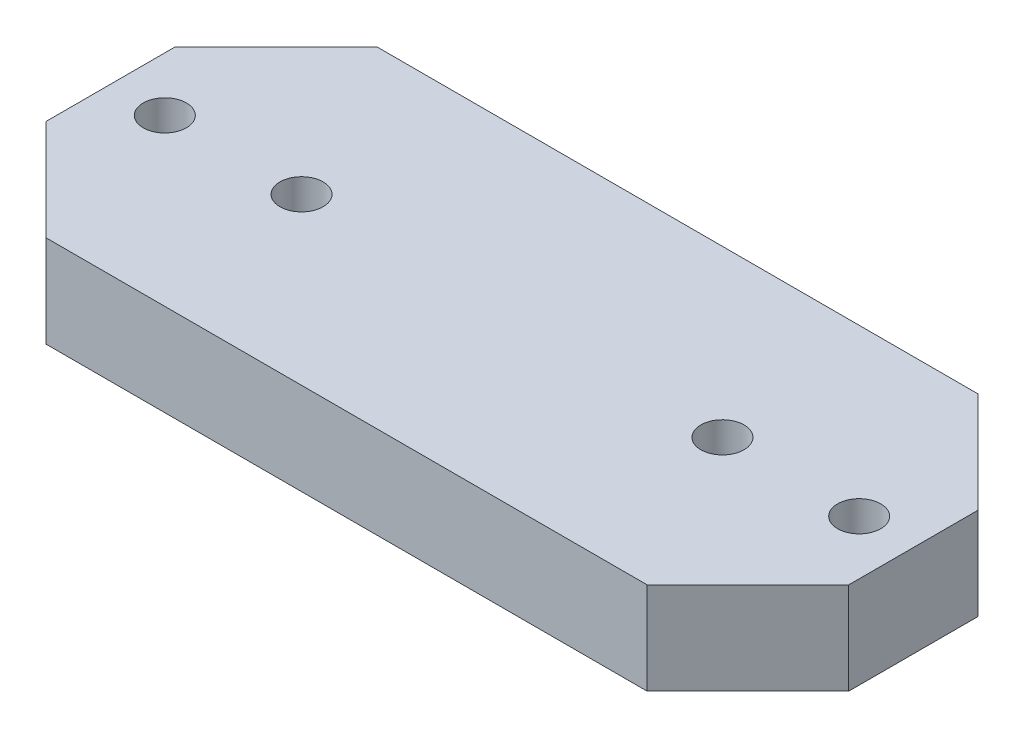
ISO-10303-21;
HEADER;
FILE_DESCRIPTION(('STEP AP214'),'2;1');
FILE_NAME('part.step','',(''),(''),'','','');
FILE_SCHEMA(('AUTOMOTIVE_DESIGN { 1 0 10303 214 1 1 1 1 }'));
ENDSEC;
DATA;
#1=APPLICATION_CONTEXT('core data for automotive mechanical design processes');
#2=APPLICATION_PROTOCOL_DEFINITION('international standard','automotive_design',2000,#1);
#3=PRODUCT_CONTEXT('',#1,'mechanical');
#4=PRODUCT('Part','Part','',(#3));
#5=PRODUCT_RELATED_PRODUCT_CATEGORY('part','',(#4));
#6=PRODUCT_DEFINITION_FORMATION('','',#4);
#7=PRODUCT_DEFINITION_CONTEXT('part definition',#1,'design');
#8=PRODUCT_DEFINITION('design','',#6,#7);
#9=PRODUCT_DEFINITION_SHAPE('','',#8);
#10=(LENGTH_UNIT() NAMED_UNIT(*) SI_UNIT(.MILLI.,.METRE.));
#11=(NAMED_UNIT(*) PLANE_ANGLE_UNIT() SI_UNIT($,.RADIAN.));
#12=(NAMED_UNIT(*) SI_UNIT($,.STERADIAN.) SOLID_ANGLE_UNIT());
#13=UNCERTAINTY_MEASURE_WITH_UNIT(LENGTH_MEASURE(1.E-05),#10,'distance_accuracy_value','');
#14=(GEOMETRIC_REPRESENTATION_CONTEXT(3) GLOBAL_UNCERTAINTY_ASSIGNED_CONTEXT((#13)) GLOBAL_UNIT_ASSIGNED_CONTEXT((#10,
#11,#12)) REPRESENTATION_CONTEXT('',''));
#15=CARTESIAN_POINT('',(0.,0.,0.));
#16=DIRECTION('',(0.,0.,1.));
#17=DIRECTION('',(1.,0.,0.));
#18=AXIS2_PLACEMENT_3D('',#15,#16,#17);
#19=CARTESIAN_POINT('',(61.1827241078742,6.4,-18.6584898350286));
#20=DIRECTION('',(0.,-1.,0.));
#21=DIRECTION('',(0.,0.,-1.));
#22=AXIS2_PLACEMENT_3D('',#19,#20,#21);
#23=PLANE('',#22);
#24=CARTESIAN_POINT('',(103.696101319983,6.4,-7.16509059439813));
#25=DIRECTION('',(0.,1.,0.));
#26=DIRECTION('',(0.,0.,-1.));
#27=AXIS2_PLACEMENT_3D('',#24,#25,#26);
#28=CIRCLE('',#27,1.50000000004747);
#29=CARTESIAN_POINT('',(103.696101319983,6.4,-8.6650905944456));
#30=VERTEX_POINT('',#29);
#31=EDGE_CURVE('E187',#30,#30,#28,.T.);
#32=ORIENTED_EDGE('',*,*,#31,.F.);
#33=EDGE_LOOP('',(#32));
#34=FACE_BOUND('',#33,.T.);
#35=CARTESIAN_POINT('',(74.4461013195849,6.4,-7.16509059439812));
#36=DIRECTION('',(0.,1.,0.));
#37=DIRECTION('',(0.,0.,1.));
#38=AXIS2_PLACEMENT_3D('',#35,#36,#37);
#39=CIRCLE('',#38,1.50000000004747);
#40=CARTESIAN_POINT('',(74.4461013195849,6.4,-5.66509059435065));
#41=VERTEX_POINT('',#40);
#42=EDGE_CURVE('E133',#41,#41,#39,.T.);
#43=ORIENTED_EDGE('',*,*,#42,.F.);
#44=EDGE_LOOP('',(#43));
#45=FACE_BOUND('',#44,.T.);
#46=DIRECTION('',(-1.,0.,0.));
#47=VECTOR('',#46,1.);
#48=CARTESIAN_POINT('',(109.959478531694,6.4,-18.6584898350286));
#49=LINE('',#48,#47);
#50=CARTESIAN_POINT('',(109.959478531694,6.4,-18.6584898350286));
#51=VERTEX_POINT('',#50);
#52=CARTESIAN_POINT('',(68.1827241078742,6.4,-18.6584898350286));
#53=VERTEX_POINT('',#52);
#54=EDGE_CURVE('E144',#51,#53,#49,.T.);
#55=ORIENTED_EDGE('',*,*,#54,.T.);
#56=DIRECTION('',(-0.707106781186556,0.,0.707106781186539));
#57=VECTOR('',#56,1.);
#58=CARTESIAN_POINT('',(68.1827241078742,6.4,-18.6584898350286));
#59=LINE('',#58,#57);
#60=CARTESIAN_POINT('',(61.1827241078742,6.4,-11.6584898350288));
#61=VERTEX_POINT('',#60);
#62=EDGE_CURVE('E92',#53,#61,#59,.T.);
#63=ORIENTED_EDGE('',*,*,#62,.T.);
#64=DIRECTION('',(0.,0.,1.));
#65=VECTOR('',#64,1.);
#66=CARTESIAN_POINT('',(61.1827241078742,6.4,-2.67169135392632));
#67=LINE('',#66,#65);
#68=CARTESIAN_POINT('',(61.1827241078742,6.4,-2.67169135392632));
#69=VERTEX_POINT('',#68);
#70=EDGE_CURVE('E159',#61,#69,#67,.T.);
#71=ORIENTED_EDGE('',*,*,#70,.T.);
#72=DIRECTION('',(0.707106781186557,0.,0.707106781186538));
#73=VECTOR('',#72,1.);
#74=CARTESIAN_POINT('',(68.1827241078742,6.4,4.32830864607351));
#75=LINE('',#74,#73);
#76=CARTESIAN_POINT('',(68.1827241078742,6.4,4.32830864607351));
#77=VERTEX_POINT('',#76);
#78=EDGE_CURVE('E172',#69,#77,#75,.T.);
#79=ORIENTED_EDGE('',*,*,#78,.T.);
#80=DIRECTION('',(1.,0.,0.));
#81=VECTOR('',#80,1.);
#82=CARTESIAN_POINT('',(109.959478531694,6.4,4.32830864607346));
#83=LINE('',#82,#81);
#84=CARTESIAN_POINT('',(109.959478531694,6.4,4.32830864607346));
#85=VERTEX_POINT('',#84);
#86=EDGE_CURVE('E111',#77,#85,#83,.T.);
#87=ORIENTED_EDGE('',*,*,#86,.T.);
#88=DIRECTION('',(0.707106781186555,0.,-0.70710678118654));
#89=VECTOR('',#88,1.);
#90=CARTESIAN_POINT('',(109.959478531694,6.4,4.32830864607346));
#91=LINE('',#90,#89);
#92=CARTESIAN_POINT('',(116.959478531694,6.4,-2.67169135392639));
#93=VERTEX_POINT('',#92);
#94=EDGE_CURVE('E105',#85,#93,#91,.T.);
#95=ORIENTED_EDGE('',*,*,#94,.T.);
#96=DIRECTION('',(0.,0.,-1.));
#97=VECTOR('',#96,1.);
#98=CARTESIAN_POINT('',(116.959478531694,6.4,-2.67169135392639));
#99=LINE('',#98,#97);
#100=CARTESIAN_POINT('',(116.959478531694,6.4,-11.6584898350288));
#101=VERTEX_POINT('',#100);
#102=EDGE_CURVE('E109',#93,#101,#99,.T.);
#103=ORIENTED_EDGE('',*,*,#102,.T.);
#104=DIRECTION('',(-0.707106781186556,0.,-0.707106781186539));
#105=VECTOR('',#104,1.);
#106=CARTESIAN_POINT('',(109.959478531694,6.4,-18.6584898350286));
#107=LINE('',#106,#105);
#108=EDGE_CURVE('E49',#101,#51,#107,.T.);
#109=ORIENTED_EDGE('',*,*,#108,.T.);
#110=EDGE_LOOP('',(#55,#63,#71,#79,#87,#95,#103,#109));
#111=FACE_BOUND('',#110,.T.);
#112=CARTESIAN_POINT('',(113.196101319983,6.4,-7.16509059447754));
#113=DIRECTION('',(0.,1.,0.));
#114=DIRECTION('',(0.,0.,-1.));
#115=AXIS2_PLACEMENT_3D('',#112,#113,#114);
#116=CIRCLE('',#115,1.50000000002425);
#117=CARTESIAN_POINT('',(113.196101319983,6.4,-8.66509059450179));
#118=VERTEX_POINT('',#117);
#119=EDGE_CURVE('E181',#118,#118,#116,.T.);
#120=ORIENTED_EDGE('',*,*,#119,.F.);
#121=EDGE_LOOP('',(#120));
#122=FACE_BOUND('',#121,.T.);
#123=CARTESIAN_POINT('',(64.9461013195849,6.4,-7.16509059447754));
#124=DIRECTION('',(0.,1.,0.));
#125=DIRECTION('',(0.,0.,1.));
#126=AXIS2_PLACEMENT_3D('',#123,#124,#125);
#127=CIRCLE('',#126,1.50000000002425);
#128=CARTESIAN_POINT('',(64.9461013195849,6.4,-5.66509059445329));
#129=VERTEX_POINT('',#128);
#130=EDGE_CURVE('E193',#129,#129,#127,.T.);
#131=ORIENTED_EDGE('',*,*,#130,.F.);
#132=EDGE_LOOP('',(#131));
#133=FACE_BOUND('',#132,.T.);
#134=ADVANCED_FACE('F32',(#34,#45,#111,#122,#133),#23,.F.);
#135=CARTESIAN_POINT('',(61.1827241078742,0.,-18.6584898350286));
#136=DIRECTION('',(0.,-1.,0.));
#137=DIRECTION('',(0.,0.,-1.));
#138=AXIS2_PLACEMENT_3D('',#135,#136,#137);
#139=PLANE('',#138);
#140=CARTESIAN_POINT('',(103.696101319983,0.,-7.16509059439813));
#141=DIRECTION('',(0.,1.,0.));
#142=DIRECTION('',(0.,0.,-1.));
#143=AXIS2_PLACEMENT_3D('',#140,#141,#142);
#144=CIRCLE('',#143,1.50000000004747);
#145=CARTESIAN_POINT('',(103.696101319983,0.,-8.6650905944456));
#146=VERTEX_POINT('',#145);
#147=EDGE_CURVE('E190',#146,#146,#144,.T.);
#148=ORIENTED_EDGE('',*,*,#147,.T.);
#149=EDGE_LOOP('',(#148));
#150=FACE_BOUND('',#149,.T.);
#151=CARTESIAN_POINT('',(74.4461013195849,0.,-7.16509059439812));
#152=DIRECTION('',(0.,1.,0.));
#153=DIRECTION('',(0.,0.,1.));
#154=AXIS2_PLACEMENT_3D('',#151,#152,#153);
#155=CIRCLE('',#154,1.50000000004747);
#156=CARTESIAN_POINT('',(74.4461013195849,0.,-5.66509059435065));
#157=VERTEX_POINT('',#156);
#158=EDGE_CURVE('E178',#157,#157,#155,.T.);
#159=ORIENTED_EDGE('',*,*,#158,.T.);
#160=EDGE_LOOP('',(#159));
#161=FACE_BOUND('',#160,.T.);
#162=DIRECTION('',(-1.,0.,0.));
#163=VECTOR('',#162,1.);
#164=CARTESIAN_POINT('',(109.959478531694,0.,-18.6584898350286));
#165=LINE('',#164,#163);
#166=CARTESIAN_POINT('',(109.959478531694,0.,-18.6584898350286));
#167=VERTEX_POINT('',#166);
#168=CARTESIAN_POINT('',(68.1827241078742,0.,-18.6584898350286));
#169=VERTEX_POINT('',#168);
#170=EDGE_CURVE('E129',#167,#169,#165,.T.);
#171=ORIENTED_EDGE('',*,*,#170,.F.);
#172=DIRECTION('',(-0.707106781186556,0.,-0.707106781186539));
#173=VECTOR('',#172,1.);
#174=CARTESIAN_POINT('',(109.959478531694,0.,-18.6584898350286));
#175=LINE('',#174,#173);
#176=CARTESIAN_POINT('',(116.959478531694,0.,-11.6584898350288));
#177=VERTEX_POINT('',#176);
#178=EDGE_CURVE('E84',#177,#167,#175,.T.);
#179=ORIENTED_EDGE('',*,*,#178,.F.);
#180=DIRECTION('',(0.,0.,-1.));
#181=VECTOR('',#180,1.);
#182=CARTESIAN_POINT('',(116.959478531694,0.,-2.67169135392639));
#183=LINE('',#182,#181);
#184=CARTESIAN_POINT('',(116.959478531694,0.,-2.67169135392639));
#185=VERTEX_POINT('',#184);
#186=EDGE_CURVE('E78',#185,#177,#183,.T.);
#187=ORIENTED_EDGE('',*,*,#186,.F.);
#188=DIRECTION('',(0.707106781186555,0.,-0.70710678118654));
#189=VECTOR('',#188,1.);
#190=CARTESIAN_POINT('',(109.959478531694,0.,4.32830864607346));
#191=LINE('',#190,#189);
#192=CARTESIAN_POINT('',(109.959478531694,0.,4.32830864607346));
#193=VERTEX_POINT('',#192);
#194=EDGE_CURVE('E119',#193,#185,#191,.T.);
#195=ORIENTED_EDGE('',*,*,#194,.F.);
#196=DIRECTION('',(1.,0.,0.));
#197=VECTOR('',#196,1.);
#198=CARTESIAN_POINT('',(109.959478531694,0.,4.32830864607346));
#199=LINE('',#198,#197);
#200=CARTESIAN_POINT('',(68.1827241078742,0.,4.32830864607351));
#201=VERTEX_POINT('',#200);
#202=EDGE_CURVE('E139',#201,#193,#199,.T.);
#203=ORIENTED_EDGE('',*,*,#202,.F.);
#204=DIRECTION('',(0.707106781186557,0.,0.707106781186538));
#205=VECTOR('',#204,1.);
#206=CARTESIAN_POINT('',(68.1827241078742,0.,4.32830864607351));
#207=LINE('',#206,#205);
#208=CARTESIAN_POINT('',(61.1827241078742,0.,-2.67169135392632));
#209=VERTEX_POINT('',#208);
#210=EDGE_CURVE('E137',#209,#201,#207,.T.);
#211=ORIENTED_EDGE('',*,*,#210,.F.);
#212=DIRECTION('',(0.,0.,1.));
#213=VECTOR('',#212,1.);
#214=CARTESIAN_POINT('',(61.1827241078742,0.,-2.67169135392632));
#215=LINE('',#214,#213);
#216=CARTESIAN_POINT('',(61.1827241078742,0.,-11.6584898350288));
#217=VERTEX_POINT('',#216);
#218=EDGE_CURVE('E135',#217,#209,#215,.T.);
#219=ORIENTED_EDGE('',*,*,#218,.F.);
#220=DIRECTION('',(-0.707106781186556,0.,0.707106781186539));
#221=VECTOR('',#220,1.);
#222=CARTESIAN_POINT('',(68.1827241078742,0.,-18.6584898350286));
#223=LINE('',#222,#221);
#224=EDGE_CURVE('E132',#169,#217,#223,.T.);
#225=ORIENTED_EDGE('',*,*,#224,.F.);
#226=EDGE_LOOP('',(#171,#179,#187,#195,#203,#211,#219,#225));
#227=FACE_BOUND('',#226,.T.);
#228=CARTESIAN_POINT('',(113.196101319983,0.,-7.16509059447754));
#229=DIRECTION('',(0.,1.,0.));
#230=DIRECTION('',(0.,0.,-1.));
#231=AXIS2_PLACEMENT_3D('',#228,#229,#230);
#232=CIRCLE('',#231,1.50000000002425);
#233=CARTESIAN_POINT('',(113.196101319983,0.,-8.66509059450179));
#234=VERTEX_POINT('',#233);
#235=EDGE_CURVE('E184',#234,#234,#232,.T.);
#236=ORIENTED_EDGE('',*,*,#235,.T.);
#237=EDGE_LOOP('',(#236));
#238=FACE_BOUND('',#237,.T.);
#239=CARTESIAN_POINT('',(64.9461013195849,0.,-7.16509059447754));
#240=DIRECTION('',(0.,1.,0.));
#241=DIRECTION('',(0.,0.,1.));
#242=AXIS2_PLACEMENT_3D('',#239,#240,#241);
#243=CIRCLE('',#242,1.50000000002425);
#244=CARTESIAN_POINT('',(64.9461013195849,0.,-5.66509059445329));
#245=VERTEX_POINT('',#244);
#246=EDGE_CURVE('E196',#245,#245,#243,.T.);
#247=ORIENTED_EDGE('',*,*,#246,.T.);
#248=EDGE_LOOP('',(#247));
#249=FACE_BOUND('',#248,.T.);
#250=ADVANCED_FACE('F163',(#150,#161,#227,#238,#249),#139,.T.);
#251=CARTESIAN_POINT('',(109.959478531694,6.4,-18.6584898350286));
#252=DIRECTION('',(0.,0.,1.));
#253=DIRECTION('',(1.,0.,0.));
#254=AXIS2_PLACEMENT_3D('',#251,#252,#253);
#255=PLANE('',#254);
#256=ORIENTED_EDGE('',*,*,#170,.T.);
#257=DIRECTION('',(0.,-1.,0.));
#258=VECTOR('',#257,1.);
#259=CARTESIAN_POINT('',(68.1827241078742,6.4,-18.6584898350286));
#260=LINE('',#259,#258);
#261=EDGE_CURVE('E11',#53,#169,#260,.T.);
#262=ORIENTED_EDGE('',*,*,#261,.F.);
#263=ORIENTED_EDGE('',*,*,#54,.F.);
#264=DIRECTION('',(0.,-1.,0.));
#265=VECTOR('',#264,1.);
#266=CARTESIAN_POINT('',(109.959478531694,6.4,-18.6584898350286));
#267=LINE('',#266,#265);
#268=EDGE_CURVE('E125',#51,#167,#267,.T.);
#269=ORIENTED_EDGE('',*,*,#268,.T.);
#270=EDGE_LOOP('',(#256,#262,#263,#269));
#271=FACE_BOUND('',#270,.T.);
#272=ADVANCED_FACE('F34',(#271),#255,.F.);
#273=CARTESIAN_POINT('',(68.1827241078742,6.4,-18.6584898350286));
#274=DIRECTION('',(0.707106781186539,0.,0.707106781186556));
#275=DIRECTION('',(0.707106781186556,0.,-0.707106781186539));
#276=AXIS2_PLACEMENT_3D('',#273,#274,#275);
#277=PLANE('',#276);
#278=ORIENTED_EDGE('',*,*,#224,.T.);
#279=DIRECTION('',(0.,-1.,0.));
#280=VECTOR('',#279,1.);
#281=CARTESIAN_POINT('',(61.1827241078742,6.4,-11.6584898350288));
#282=LINE('',#281,#280);
#283=EDGE_CURVE('E41',#61,#217,#282,.T.);
#284=ORIENTED_EDGE('',*,*,#283,.F.);
#285=ORIENTED_EDGE('',*,*,#62,.F.);
#286=ORIENTED_EDGE('',*,*,#261,.T.);
#287=EDGE_LOOP('',(#278,#284,#285,#286));
#288=FACE_BOUND('',#287,.T.);
#289=ADVANCED_FACE('F231',(#288),#277,.F.);
#290=CARTESIAN_POINT('',(61.1827241078742,6.4,-2.67169135392632));
#291=DIRECTION('',(1.,0.,0.));
#292=DIRECTION('',(0.,0.,-1.));
#293=AXIS2_PLACEMENT_3D('',#290,#291,#292);
#294=PLANE('',#293);
#295=ORIENTED_EDGE('',*,*,#218,.T.);
#296=DIRECTION('',(0.,-1.,0.));
#297=VECTOR('',#296,1.);
#298=CARTESIAN_POINT('',(61.1827241078742,6.4,-2.67169135392632));
#299=LINE('',#298,#297);
#300=EDGE_CURVE('E151',#69,#209,#299,.T.);
#301=ORIENTED_EDGE('',*,*,#300,.F.);
#302=ORIENTED_EDGE('',*,*,#70,.F.);
#303=ORIENTED_EDGE('',*,*,#283,.T.);
#304=EDGE_LOOP('',(#295,#301,#302,#303));
#305=FACE_BOUND('',#304,.T.);
#306=ADVANCED_FACE('F157',(#305),#294,.F.);
#307=CARTESIAN_POINT('',(68.1827241078742,6.4,4.32830864607351));
#308=DIRECTION('',(0.707106781186538,0.,-0.707106781186557));
#309=DIRECTION('',(-0.707106781186557,0.,-0.707106781186538));
#310=AXIS2_PLACEMENT_3D('',#307,#308,#309);
#311=PLANE('',#310);
#312=ORIENTED_EDGE('',*,*,#210,.T.);
#313=DIRECTION('',(0.,-1.,0.));
#314=VECTOR('',#313,1.);
#315=CARTESIAN_POINT('',(68.1827241078742,6.4,4.32830864607351));
#316=LINE('',#315,#314);
#317=EDGE_CURVE('E148',#77,#201,#316,.T.);
#318=ORIENTED_EDGE('',*,*,#317,.F.);
#319=ORIENTED_EDGE('',*,*,#78,.F.);
#320=ORIENTED_EDGE('',*,*,#300,.T.);
#321=EDGE_LOOP('',(#312,#318,#319,#320));
#322=FACE_BOUND('',#321,.T.);
#323=ADVANCED_FACE('F168',(#322),#311,.F.);
#324=CARTESIAN_POINT('',(109.959478531694,6.4,4.32830864607346));
#325=DIRECTION('',(0.,0.,-1.));
#326=DIRECTION('',(-1.,0.,0.));
#327=AXIS2_PLACEMENT_3D('',#324,#325,#326);
#328=PLANE('',#327);
#329=ORIENTED_EDGE('',*,*,#202,.T.);
#330=DIRECTION('',(0.,-1.,0.));
#331=VECTOR('',#330,1.);
#332=CARTESIAN_POINT('',(109.959478531694,6.4,4.32830864607346));
#333=LINE('',#332,#331);
#334=EDGE_CURVE('E120',#85,#193,#333,.T.);
#335=ORIENTED_EDGE('',*,*,#334,.F.);
#336=ORIENTED_EDGE('',*,*,#86,.F.);
#337=ORIENTED_EDGE('',*,*,#317,.T.);
#338=EDGE_LOOP('',(#329,#335,#336,#337));
#339=FACE_BOUND('',#338,.T.);
#340=ADVANCED_FACE('F171',(#339),#328,.F.);
#341=CARTESIAN_POINT('',(109.959478531694,6.4,4.32830864607346));
#342=DIRECTION('',(-0.70710678118654,0.,-0.707106781186555));
#343=DIRECTION('',(-0.707106781186555,0.,0.70710678118654));
#344=AXIS2_PLACEMENT_3D('',#341,#342,#343);
#345=PLANE('',#344);
#346=ORIENTED_EDGE('',*,*,#194,.T.);
#347=DIRECTION('',(0.,-1.,0.));
#348=VECTOR('',#347,1.);
#349=CARTESIAN_POINT('',(116.959478531694,6.4,-2.67169135392639));
#350=LINE('',#349,#348);
#351=EDGE_CURVE('E116',#93,#185,#350,.T.);
#352=ORIENTED_EDGE('',*,*,#351,.F.);
#353=ORIENTED_EDGE('',*,*,#94,.F.);
#354=ORIENTED_EDGE('',*,*,#334,.T.);
#355=EDGE_LOOP('',(#346,#352,#353,#354));
#356=FACE_BOUND('',#355,.T.);
#357=ADVANCED_FACE('F117',(#356),#345,.F.);
#358=CARTESIAN_POINT('',(116.959478531694,6.4,-2.67169135392639));
#359=DIRECTION('',(-1.,0.,0.));
#360=DIRECTION('',(0.,0.,1.));
#361=AXIS2_PLACEMENT_3D('',#358,#359,#360);
#362=PLANE('',#361);
#363=ORIENTED_EDGE('',*,*,#186,.T.);
#364=DIRECTION('',(0.,-1.,0.));
#365=VECTOR('',#364,1.);
#366=CARTESIAN_POINT('',(116.959478531694,6.4,-11.6584898350288));
#367=LINE('',#366,#365);
#368=EDGE_CURVE('E121',#101,#177,#367,.T.);
#369=ORIENTED_EDGE('',*,*,#368,.F.);
#370=ORIENTED_EDGE('',*,*,#102,.F.);
#371=ORIENTED_EDGE('',*,*,#351,.T.);
#372=EDGE_LOOP('',(#363,#369,#370,#371));
#373=FACE_BOUND('',#372,.T.);
#374=ADVANCED_FACE('F123',(#373),#362,.F.);
#375=CARTESIAN_POINT('',(109.959478531694,6.4,-18.6584898350286));
#376=DIRECTION('',(-0.707106781186539,0.,0.707106781186556));
#377=DIRECTION('',(0.707106781186556,0.,0.707106781186539));
#378=AXIS2_PLACEMENT_3D('',#375,#376,#377);
#379=PLANE('',#378);
#380=ORIENTED_EDGE('',*,*,#178,.T.);
#381=ORIENTED_EDGE('',*,*,#268,.F.);
#382=ORIENTED_EDGE('',*,*,#108,.F.);
#383=ORIENTED_EDGE('',*,*,#368,.T.);
#384=EDGE_LOOP('',(#380,#381,#382,#383));
#385=FACE_BOUND('',#384,.T.);
#386=ADVANCED_FACE('F219',(#385),#379,.F.);
#387=CARTESIAN_POINT('',(74.4461013195849,6.4,-7.16509059439812));
#388=DIRECTION('',(0.,-1.,0.));
#389=DIRECTION('',(0.,0.,-1.));
#390=AXIS2_PLACEMENT_3D('',#387,#388,#389);
#391=CYLINDRICAL_SURFACE('',#390,1.50000000004747);
#392=ORIENTED_EDGE('',*,*,#42,.T.);
#393=EDGE_LOOP('',(#392));
#394=FACE_BOUND('',#393,.T.);
#395=ORIENTED_EDGE('',*,*,#158,.F.);
#396=EDGE_LOOP('',(#395));
#397=FACE_BOUND('',#396,.T.);
#398=ADVANCED_FACE('F216',(#394,#397),#391,.F.);
#399=CARTESIAN_POINT('',(113.196101319983,6.4,-7.16509059447754));
#400=DIRECTION('',(0.,-1.,0.));
#401=DIRECTION('',(0.,0.,-1.));
#402=AXIS2_PLACEMENT_3D('',#399,#400,#401);
#403=CYLINDRICAL_SURFACE('',#402,1.50000000002425);
#404=ORIENTED_EDGE('',*,*,#119,.T.);
#405=EDGE_LOOP('',(#404));
#406=FACE_BOUND('',#405,.T.);
#407=ORIENTED_EDGE('',*,*,#235,.F.);
#408=EDGE_LOOP('',(#407));
#409=FACE_BOUND('',#408,.T.);
#410=ADVANCED_FACE('F295',(#406,#409),#403,.F.);
#411=CARTESIAN_POINT('',(103.696101319983,6.4,-7.16509059439813));
#412=DIRECTION('',(0.,-1.,0.));
#413=DIRECTION('',(0.,0.,-1.));
#414=AXIS2_PLACEMENT_3D('',#411,#412,#413);
#415=CYLINDRICAL_SURFACE('',#414,1.50000000004747);
#416=ORIENTED_EDGE('',*,*,#31,.T.);
#417=EDGE_LOOP('',(#416));
#418=FACE_BOUND('',#417,.T.);
#419=ORIENTED_EDGE('',*,*,#147,.F.);
#420=EDGE_LOOP('',(#419));
#421=FACE_BOUND('',#420,.T.);
#422=ADVANCED_FACE('F303',(#418,#421),#415,.F.);
#423=CARTESIAN_POINT('',(64.9461013195849,6.4,-7.16509059447754));
#424=DIRECTION('',(0.,-1.,0.));
#425=DIRECTION('',(0.,0.,-1.));
#426=AXIS2_PLACEMENT_3D('',#423,#424,#425);
#427=CYLINDRICAL_SURFACE('',#426,1.50000000002425);
#428=ORIENTED_EDGE('',*,*,#130,.T.);
#429=EDGE_LOOP('',(#428));
#430=FACE_BOUND('',#429,.T.);
#431=ORIENTED_EDGE('',*,*,#246,.F.);
#432=EDGE_LOOP('',(#431));
#433=FACE_BOUND('',#432,.T.);
#434=ADVANCED_FACE('F202',(#430,#433),#427,.F.);
#435=CLOSED_SHELL('',(#134,#250,#272,#289,#306,#323,#340,#357,#374,#386,#398,#410,#422,#434));
#436=MANIFOLD_SOLID_BREP('B2',#435);
#437=ADVANCED_BREP_SHAPE_REPRESENTATION('',(#18,#436),#14);
#438=SHAPE_DEFINITION_REPRESENTATION(#9,#437);
ENDSEC;
END-ISO-10303-21;
